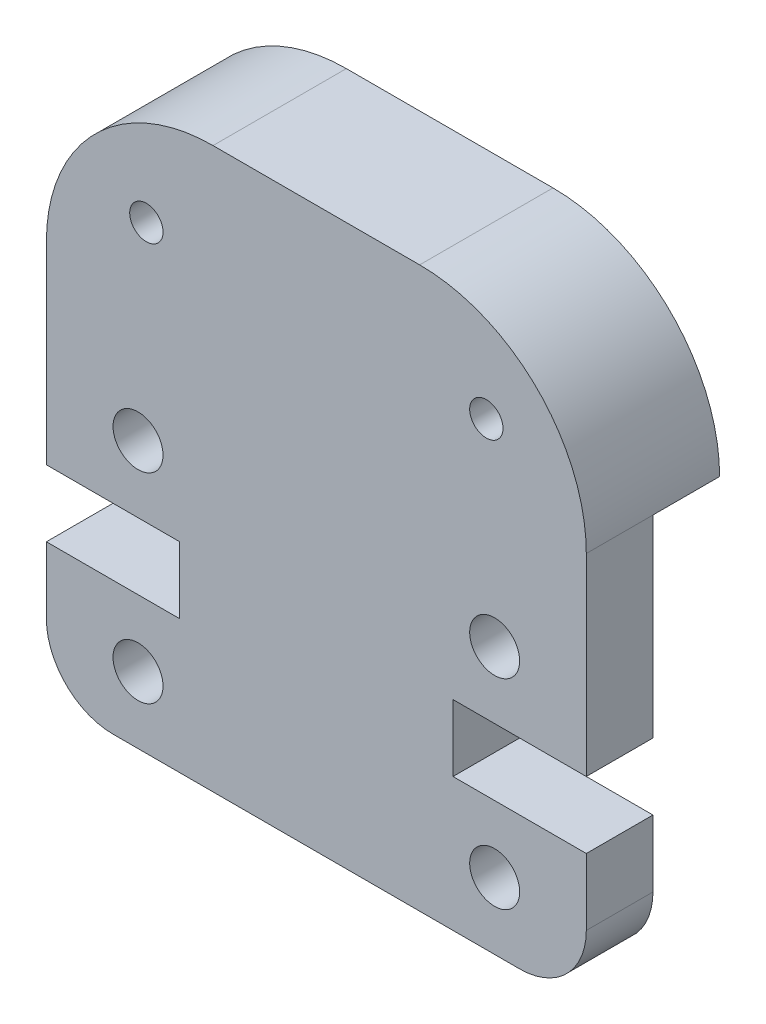
ISO-10303-21;
HEADER;
FILE_DESCRIPTION(('STEP AP214'),'2;1');
FILE_NAME('part.step','',(''),(''),'','','');
FILE_SCHEMA(('AUTOMOTIVE_DESIGN { 1 0 10303 214 1 1 1 1 }'));
ENDSEC;
DATA;
#1=APPLICATION_CONTEXT('core data for automotive mechanical design processes');
#2=APPLICATION_PROTOCOL_DEFINITION('international standard','automotive_design',2000,#1);
#3=PRODUCT_CONTEXT('',#1,'mechanical');
#4=PRODUCT('Part','Part','',(#3));
#5=PRODUCT_RELATED_PRODUCT_CATEGORY('part','',(#4));
#6=PRODUCT_DEFINITION_FORMATION('','',#4);
#7=PRODUCT_DEFINITION_CONTEXT('part definition',#1,'design');
#8=PRODUCT_DEFINITION('design','',#6,#7);
#9=PRODUCT_DEFINITION_SHAPE('','',#8);
#10=(LENGTH_UNIT() NAMED_UNIT(*) SI_UNIT(.MILLI.,.METRE.));
#11=(NAMED_UNIT(*) PLANE_ANGLE_UNIT() SI_UNIT($,.RADIAN.));
#12=(NAMED_UNIT(*) SI_UNIT($,.STERADIAN.) SOLID_ANGLE_UNIT());
#13=UNCERTAINTY_MEASURE_WITH_UNIT(LENGTH_MEASURE(1.E-05),#10,'distance_accuracy_value','');
#14=(GEOMETRIC_REPRESENTATION_CONTEXT(3) GLOBAL_UNCERTAINTY_ASSIGNED_CONTEXT((#13)) GLOBAL_UNIT_ASSIGNED_CONTEXT((#10,
#11,#12)) REPRESENTATION_CONTEXT('',''));
#15=CARTESIAN_POINT('',(0.,0.,0.));
#16=DIRECTION('',(0.,0.,1.));
#17=DIRECTION('',(1.,0.,0.));
#18=AXIS2_PLACEMENT_3D('',#15,#16,#17);
#19=CARTESIAN_POINT('',(5.,11.795,0.));
#20=DIRECTION('',(0.,0.,1.));
#21=DIRECTION('',(1.,0.,0.));
#22=AXIS2_PLACEMENT_3D('',#19,#20,#21);
#23=PLANE('',#22);
#24=CARTESIAN_POINT('',(13.1999999999957,13.7949999999999,0.));
#25=DIRECTION('',(0.,0.,1.));
#26=DIRECTION('',(-1.,0.,0.));
#27=AXIS2_PLACEMENT_3D('',#24,#25,#26);
#28=CIRCLE('',#27,0.499999999999945);
#29=CARTESIAN_POINT('',(12.6999999999957,13.7949999999999,0.));
#30=VERTEX_POINT('',#29);
#31=EDGE_CURVE('E263',#30,#30,#28,.T.);
#32=ORIENTED_EDGE('',*,*,#31,.T.);
#33=EDGE_LOOP('',(#32));
#34=FACE_BOUND('',#33,.T.);
#35=CARTESIAN_POINT('',(3.00000000000434,13.7949999999999,0.));
#36=DIRECTION('',(0.,0.,1.));
#37=DIRECTION('',(1.,0.,0.));
#38=AXIS2_PLACEMENT_3D('',#35,#36,#37);
#39=CIRCLE('',#38,0.499999999999945);
#40=CARTESIAN_POINT('',(3.50000000000429,13.7949999999999,0.));
#41=VERTEX_POINT('',#40);
#42=EDGE_CURVE('E267',#41,#41,#39,.T.);
#43=ORIENTED_EDGE('',*,*,#42,.T.);
#44=EDGE_LOOP('',(#43));
#45=FACE_BOUND('',#44,.T.);
#46=DIRECTION('',(-1.,0.,0.));
#47=VECTOR('',#46,1.);
#48=CARTESIAN_POINT('',(0.,11.795,0.));
#49=LINE('',#48,#47);
#50=CARTESIAN_POINT('',(16.2,11.795,0.));
#51=VERTEX_POINT('',#50);
#52=CARTESIAN_POINT('',(0.,11.795,0.));
#53=VERTEX_POINT('',#52);
#54=EDGE_CURVE('E221',#51,#53,#49,.T.);
#55=ORIENTED_EDGE('',*,*,#54,.T.);
#56=CARTESIAN_POINT('',(5.,11.795,0.));
#57=DIRECTION('',(0.,0.,1.));
#58=DIRECTION('',(1.,0.,0.));
#59=AXIS2_PLACEMENT_3D('',#56,#57,#58);
#60=CIRCLE('',#59,5.);
#61=CARTESIAN_POINT('',(5.,16.795,0.));
#62=VERTEX_POINT('',#61);
#63=EDGE_CURVE('E148',#62,#53,#60,.T.);
#64=ORIENTED_EDGE('',*,*,#63,.F.);
#65=DIRECTION('',(-1.,0.,0.));
#66=VECTOR('',#65,1.);
#67=CARTESIAN_POINT('',(5.,16.795,0.));
#68=LINE('',#67,#66);
#69=CARTESIAN_POINT('',(11.2,16.795,0.));
#70=VERTEX_POINT('',#69);
#71=EDGE_CURVE('E73',#70,#62,#68,.T.);
#72=ORIENTED_EDGE('',*,*,#71,.F.);
#73=CARTESIAN_POINT('',(11.2,11.795,0.));
#74=DIRECTION('',(0.,0.,1.));
#75=DIRECTION('',(-1.,0.,0.));
#76=AXIS2_PLACEMENT_3D('',#73,#74,#75);
#77=CIRCLE('',#76,5.);
#78=EDGE_CURVE('E67',#51,#70,#77,.T.);
#79=ORIENTED_EDGE('',*,*,#78,.F.);
#80=EDGE_LOOP('',(#55,#64,#72,#79));
#81=FACE_BOUND('',#80,.T.);
#82=ADVANCED_FACE('F34',(#34,#45,#81),#23,.F.);
#83=CARTESIAN_POINT('',(0.,6.00000000000001,4.));
#84=DIRECTION('',(1.,0.,0.));
#85=DIRECTION('',(0.,0.,-1.));
#86=AXIS2_PLACEMENT_3D('',#83,#84,#85);
#87=PLANE('',#86);
#88=DIRECTION('',(0.,-1.,0.));
#89=VECTOR('',#88,1.);
#90=CARTESIAN_POINT('',(0.,0.,2.));
#91=LINE('',#90,#89);
#92=CARTESIAN_POINT('',(0.,11.795,2.));
#93=VERTEX_POINT('',#92);
#94=CARTESIAN_POINT('',(0.,6.00000000000001,2.));
#95=VERTEX_POINT('',#94);
#96=EDGE_CURVE('E204',#93,#95,#91,.T.);
#97=ORIENTED_EDGE('',*,*,#96,.T.);
#98=DIRECTION('',(0.,0.,-1.));
#99=VECTOR('',#98,1.);
#100=CARTESIAN_POINT('',(0.,6.00000000000001,4.));
#101=LINE('',#100,#99);
#102=CARTESIAN_POINT('',(0.,6.00000000000001,4.));
#103=VERTEX_POINT('',#102);
#104=EDGE_CURVE('E44',#103,#95,#101,.T.);
#105=ORIENTED_EDGE('',*,*,#104,.F.);
#106=DIRECTION('',(0.,-1.,0.));
#107=VECTOR('',#106,1.);
#108=CARTESIAN_POINT('',(0.,6.00000000000001,4.));
#109=LINE('',#108,#107);
#110=CARTESIAN_POINT('',(0.,11.795,4.));
#111=VERTEX_POINT('',#110);
#112=EDGE_CURVE('E81',#111,#103,#109,.T.);
#113=ORIENTED_EDGE('',*,*,#112,.F.);
#114=DIRECTION('',(0.,0.,-1.));
#115=VECTOR('',#114,1.);
#116=CARTESIAN_POINT('',(0.,11.795,4.));
#117=LINE('',#116,#115);
#118=EDGE_CURVE('E11',#111,#93,#117,.T.);
#119=ORIENTED_EDGE('',*,*,#118,.T.);
#120=EDGE_LOOP('',(#97,#105,#113,#119));
#121=FACE_BOUND('',#120,.T.);
#122=ADVANCED_FACE('F202',(#121),#87,.F.);
#123=CARTESIAN_POINT('',(0.,6.00000000000001,4.));
#124=DIRECTION('',(0.,1.,0.));
#125=DIRECTION('',(0.,0.,1.));
#126=AXIS2_PLACEMENT_3D('',#123,#124,#125);
#127=PLANE('',#126);
#128=DIRECTION('',(-1.,0.,0.));
#129=VECTOR('',#128,1.);
#130=CARTESIAN_POINT('',(0.,6.00000000000001,2.));
#131=LINE('',#130,#129);
#132=CARTESIAN_POINT('',(4.,6.00000000000001,2.));
#133=VERTEX_POINT('',#132);
#134=EDGE_CURVE('E196',#133,#95,#131,.T.);
#135=ORIENTED_EDGE('',*,*,#134,.F.);
#136=DIRECTION('',(0.,0.,-1.));
#137=VECTOR('',#136,1.);
#138=CARTESIAN_POINT('',(4.,6.00000000000001,4.));
#139=LINE('',#138,#137);
#140=CARTESIAN_POINT('',(4.,6.00000000000001,4.));
#141=VERTEX_POINT('',#140);
#142=EDGE_CURVE('E185',#141,#133,#139,.T.);
#143=ORIENTED_EDGE('',*,*,#142,.F.);
#144=DIRECTION('',(1.,0.,0.));
#145=VECTOR('',#144,1.);
#146=CARTESIAN_POINT('',(0.,6.00000000000001,4.));
#147=LINE('',#146,#145);
#148=EDGE_CURVE('E197',#103,#141,#147,.T.);
#149=ORIENTED_EDGE('',*,*,#148,.F.);
#150=ORIENTED_EDGE('',*,*,#104,.T.);
#151=EDGE_LOOP('',(#135,#143,#149,#150));
#152=FACE_BOUND('',#151,.T.);
#153=ADVANCED_FACE('F193',(#152),#127,.F.);
#154=CARTESIAN_POINT('',(4.,6.00000000000001,4.));
#155=DIRECTION('',(1.,0.,0.));
#156=DIRECTION('',(0.,0.,-1.));
#157=AXIS2_PLACEMENT_3D('',#154,#155,#156);
#158=PLANE('',#157);
#159=DIRECTION('',(0.,1.,0.));
#160=VECTOR('',#159,1.);
#161=CARTESIAN_POINT('',(4.,6.00000000000001,2.));
#162=LINE('',#161,#160);
#163=CARTESIAN_POINT('',(4.,4.,2.));
#164=VERTEX_POINT('',#163);
#165=EDGE_CURVE('E253',#164,#133,#162,.T.);
#166=ORIENTED_EDGE('',*,*,#165,.F.);
#167=DIRECTION('',(0.,0.,-1.));
#168=VECTOR('',#167,1.);
#169=CARTESIAN_POINT('',(4.,4.,4.));
#170=LINE('',#169,#168);
#171=CARTESIAN_POINT('',(4.,4.,4.));
#172=VERTEX_POINT('',#171);
#173=EDGE_CURVE('E182',#172,#164,#170,.T.);
#174=ORIENTED_EDGE('',*,*,#173,.F.);
#175=DIRECTION('',(0.,-1.,0.));
#176=VECTOR('',#175,1.);
#177=CARTESIAN_POINT('',(4.,6.00000000000001,4.));
#178=LINE('',#177,#176);
#179=EDGE_CURVE('E283',#141,#172,#178,.T.);
#180=ORIENTED_EDGE('',*,*,#179,.F.);
#181=ORIENTED_EDGE('',*,*,#142,.T.);
#182=EDGE_LOOP('',(#166,#174,#180,#181));
#183=FACE_BOUND('',#182,.T.);
#184=ADVANCED_FACE('F329',(#183),#158,.F.);
#185=CARTESIAN_POINT('',(4.,4.,4.));
#186=DIRECTION('',(0.,-1.,0.));
#187=DIRECTION('',(0.,0.,-1.));
#188=AXIS2_PLACEMENT_3D('',#185,#186,#187);
#189=PLANE('',#188);
#190=DIRECTION('',(1.,0.,0.));
#191=VECTOR('',#190,1.);
#192=CARTESIAN_POINT('',(4.,4.,2.));
#193=LINE('',#192,#191);
#194=CARTESIAN_POINT('',(0.,4.,2.));
#195=VERTEX_POINT('',#194);
#196=EDGE_CURVE('E250',#195,#164,#193,.T.);
#197=ORIENTED_EDGE('',*,*,#196,.F.);
#198=DIRECTION('',(0.,0.,-1.));
#199=VECTOR('',#198,1.);
#200=CARTESIAN_POINT('',(0.,4.,4.));
#201=LINE('',#200,#199);
#202=CARTESIAN_POINT('',(0.,4.,4.));
#203=VERTEX_POINT('',#202);
#204=EDGE_CURVE('E179',#203,#195,#201,.T.);
#205=ORIENTED_EDGE('',*,*,#204,.F.);
#206=DIRECTION('',(-1.,0.,0.));
#207=VECTOR('',#206,1.);
#208=CARTESIAN_POINT('',(4.,4.,4.));
#209=LINE('',#208,#207);
#210=EDGE_CURVE('E285',#172,#203,#209,.T.);
#211=ORIENTED_EDGE('',*,*,#210,.F.);
#212=ORIENTED_EDGE('',*,*,#173,.T.);
#213=EDGE_LOOP('',(#197,#205,#211,#212));
#214=FACE_BOUND('',#213,.T.);
#215=ADVANCED_FACE('F333',(#214),#189,.F.);
#216=CARTESIAN_POINT('',(0.,2.,4.));
#217=DIRECTION('',(1.,0.,0.));
#218=DIRECTION('',(0.,0.,-1.));
#219=AXIS2_PLACEMENT_3D('',#216,#217,#218);
#220=PLANE('',#219);
#221=CARTESIAN_POINT('',(0.,2.,2.));
#222=VERTEX_POINT('',#221);
#223=EDGE_CURVE('E211',#195,#222,#91,.T.);
#224=ORIENTED_EDGE('',*,*,#223,.T.);
#225=DIRECTION('',(0.,0.,-1.));
#226=VECTOR('',#225,1.);
#227=CARTESIAN_POINT('',(0.,2.,4.));
#228=LINE('',#227,#226);
#229=CARTESIAN_POINT('',(0.,2.,4.));
#230=VERTEX_POINT('',#229);
#231=EDGE_CURVE('E176',#230,#222,#228,.T.);
#232=ORIENTED_EDGE('',*,*,#231,.F.);
#233=DIRECTION('',(0.,-1.,0.));
#234=VECTOR('',#233,1.);
#235=CARTESIAN_POINT('',(0.,2.,4.));
#236=LINE('',#235,#234);
#237=EDGE_CURVE('E287',#203,#230,#236,.T.);
#238=ORIENTED_EDGE('',*,*,#237,.F.);
#239=ORIENTED_EDGE('',*,*,#204,.T.);
#240=EDGE_LOOP('',(#224,#232,#238,#239));
#241=FACE_BOUND('',#240,.T.);
#242=ADVANCED_FACE('F391',(#241),#220,.F.);
#243=CARTESIAN_POINT('',(2.,2.,4.));
#244=DIRECTION('',(0.,0.,-1.));
#245=DIRECTION('',(-1.,0.,0.));
#246=AXIS2_PLACEMENT_3D('',#243,#244,#245);
#247=CYLINDRICAL_SURFACE('',#246,2.);
#248=CARTESIAN_POINT('',(2.,2.,2.));
#249=DIRECTION('',(0.,0.,-1.));
#250=DIRECTION('',(-1.,0.,0.));
#251=AXIS2_PLACEMENT_3D('',#248,#249,#250);
#252=CIRCLE('',#251,2.);
#253=CARTESIAN_POINT('',(2.,0.,2.));
#254=VERTEX_POINT('',#253);
#255=EDGE_CURVE('E247',#254,#222,#252,.T.);
#256=ORIENTED_EDGE('',*,*,#255,.F.);
#257=DIRECTION('',(0.,0.,-1.));
#258=VECTOR('',#257,1.);
#259=CARTESIAN_POINT('',(2.,0.,4.));
#260=LINE('',#259,#258);
#261=CARTESIAN_POINT('',(2.,0.,4.));
#262=VERTEX_POINT('',#261);
#263=EDGE_CURVE('E173',#262,#254,#260,.T.);
#264=ORIENTED_EDGE('',*,*,#263,.F.);
#265=CARTESIAN_POINT('',(2.,2.,4.));
#266=DIRECTION('',(0.,0.,1.));
#267=DIRECTION('',(1.,0.,0.));
#268=AXIS2_PLACEMENT_3D('',#265,#266,#267);
#269=CIRCLE('',#268,2.);
#270=EDGE_CURVE('E289',#230,#262,#269,.T.);
#271=ORIENTED_EDGE('',*,*,#270,.F.);
#272=ORIENTED_EDGE('',*,*,#231,.T.);
#273=EDGE_LOOP('',(#256,#264,#271,#272));
#274=FACE_BOUND('',#273,.T.);
#275=ADVANCED_FACE('F387',(#274),#247,.T.);
#276=CARTESIAN_POINT('',(2.,0.,4.));
#277=DIRECTION('',(0.,1.,0.));
#278=DIRECTION('',(-1.,0.,0.));
#279=AXIS2_PLACEMENT_3D('',#276,#277,#278);
#280=PLANE('',#279);
#281=DIRECTION('',(1.,0.,0.));
#282=VECTOR('',#281,1.);
#283=CARTESIAN_POINT('',(16.2,0.,2.));
#284=LINE('',#283,#282);
#285=CARTESIAN_POINT('',(14.2,0.,2.));
#286=VERTEX_POINT('',#285);
#287=EDGE_CURVE('E223',#254,#286,#284,.T.);
#288=ORIENTED_EDGE('',*,*,#287,.T.);
#289=DIRECTION('',(0.,0.,-1.));
#290=VECTOR('',#289,1.);
#291=CARTESIAN_POINT('',(14.2,0.,4.));
#292=LINE('',#291,#290);
#293=CARTESIAN_POINT('',(14.2,0.,4.));
#294=VERTEX_POINT('',#293);
#295=EDGE_CURVE('E170',#294,#286,#292,.T.);
#296=ORIENTED_EDGE('',*,*,#295,.F.);
#297=DIRECTION('',(1.,0.,0.));
#298=VECTOR('',#297,1.);
#299=CARTESIAN_POINT('',(2.,0.,4.));
#300=LINE('',#299,#298);
#301=EDGE_CURVE('E291',#262,#294,#300,.T.);
#302=ORIENTED_EDGE('',*,*,#301,.F.);
#303=ORIENTED_EDGE('',*,*,#263,.T.);
#304=EDGE_LOOP('',(#288,#296,#302,#303));
#305=FACE_BOUND('',#304,.T.);
#306=ADVANCED_FACE('F383',(#305),#280,.F.);
#307=CARTESIAN_POINT('',(14.2,2.,4.));
#308=DIRECTION('',(0.,0.,-1.));
#309=DIRECTION('',(-1.,0.,0.));
#310=AXIS2_PLACEMENT_3D('',#307,#308,#309);
#311=CYLINDRICAL_SURFACE('',#310,2.);
#312=CARTESIAN_POINT('',(14.2,2.,2.));
#313=DIRECTION('',(0.,0.,-1.));
#314=DIRECTION('',(-1.,0.,0.));
#315=AXIS2_PLACEMENT_3D('',#312,#313,#314);
#316=CIRCLE('',#315,2.);
#317=CARTESIAN_POINT('',(16.2,2.,2.));
#318=VERTEX_POINT('',#317);
#319=EDGE_CURVE('E244',#318,#286,#316,.T.);
#320=ORIENTED_EDGE('',*,*,#319,.F.);
#321=DIRECTION('',(0.,0.,-1.));
#322=VECTOR('',#321,1.);
#323=CARTESIAN_POINT('',(16.2,2.,4.));
#324=LINE('',#323,#322);
#325=CARTESIAN_POINT('',(16.2,2.,4.));
#326=VERTEX_POINT('',#325);
#327=EDGE_CURVE('E167',#326,#318,#324,.T.);
#328=ORIENTED_EDGE('',*,*,#327,.F.);
#329=CARTESIAN_POINT('',(14.2,2.,4.));
#330=DIRECTION('',(0.,0.,1.));
#331=DIRECTION('',(-1.,0.,0.));
#332=AXIS2_PLACEMENT_3D('',#329,#330,#331);
#333=CIRCLE('',#332,2.);
#334=EDGE_CURVE('E293',#294,#326,#333,.T.);
#335=ORIENTED_EDGE('',*,*,#334,.F.);
#336=ORIENTED_EDGE('',*,*,#295,.T.);
#337=EDGE_LOOP('',(#320,#328,#335,#336));
#338=FACE_BOUND('',#337,.T.);
#339=ADVANCED_FACE('F379',(#338),#311,.T.);
#340=CARTESIAN_POINT('',(16.2,2.,4.));
#341=DIRECTION('',(-1.,0.,0.));
#342=DIRECTION('',(0.,0.,1.));
#343=AXIS2_PLACEMENT_3D('',#340,#341,#342);
#344=PLANE('',#343);
#345=DIRECTION('',(0.,1.,0.));
#346=VECTOR('',#345,1.);
#347=CARTESIAN_POINT('',(16.2,11.795,2.));
#348=LINE('',#347,#346);
#349=CARTESIAN_POINT('',(16.2,4.,2.));
#350=VERTEX_POINT('',#349);
#351=EDGE_CURVE('E625',#318,#350,#348,.T.);
#352=ORIENTED_EDGE('',*,*,#351,.T.);
#353=DIRECTION('',(0.,0.,-1.));
#354=VECTOR('',#353,1.);
#355=CARTESIAN_POINT('',(16.2,4.,4.));
#356=LINE('',#355,#354);
#357=CARTESIAN_POINT('',(16.2,4.,4.));
#358=VERTEX_POINT('',#357);
#359=EDGE_CURVE('E164',#358,#350,#356,.T.);
#360=ORIENTED_EDGE('',*,*,#359,.F.);
#361=DIRECTION('',(0.,1.,0.));
#362=VECTOR('',#361,1.);
#363=CARTESIAN_POINT('',(16.2,2.,4.));
#364=LINE('',#363,#362);
#365=EDGE_CURVE('E295',#326,#358,#364,.T.);
#366=ORIENTED_EDGE('',*,*,#365,.F.);
#367=ORIENTED_EDGE('',*,*,#327,.T.);
#368=EDGE_LOOP('',(#352,#360,#366,#367));
#369=FACE_BOUND('',#368,.T.);
#370=ADVANCED_FACE('F375',(#369),#344,.F.);
#371=CARTESIAN_POINT('',(12.2,4.,4.));
#372=DIRECTION('',(0.,-1.,0.));
#373=DIRECTION('',(1.,0.,0.));
#374=AXIS2_PLACEMENT_3D('',#371,#372,#373);
#375=PLANE('',#374);
#376=DIRECTION('',(1.,0.,0.));
#377=VECTOR('',#376,1.);
#378=CARTESIAN_POINT('',(12.2,4.,2.));
#379=LINE('',#378,#377);
#380=CARTESIAN_POINT('',(12.2,4.,2.));
#381=VERTEX_POINT('',#380);
#382=EDGE_CURVE('E241',#381,#350,#379,.T.);
#383=ORIENTED_EDGE('',*,*,#382,.F.);
#384=DIRECTION('',(0.,0.,-1.));
#385=VECTOR('',#384,1.);
#386=CARTESIAN_POINT('',(12.2,4.,4.));
#387=LINE('',#386,#385);
#388=CARTESIAN_POINT('',(12.2,4.,4.));
#389=VERTEX_POINT('',#388);
#390=EDGE_CURVE('E161',#389,#381,#387,.T.);
#391=ORIENTED_EDGE('',*,*,#390,.F.);
#392=DIRECTION('',(-1.,0.,0.));
#393=VECTOR('',#392,1.);
#394=CARTESIAN_POINT('',(12.2,4.,4.));
#395=LINE('',#394,#393);
#396=EDGE_CURVE('E297',#358,#389,#395,.T.);
#397=ORIENTED_EDGE('',*,*,#396,.F.);
#398=ORIENTED_EDGE('',*,*,#359,.T.);
#399=EDGE_LOOP('',(#383,#391,#397,#398));
#400=FACE_BOUND('',#399,.T.);
#401=ADVANCED_FACE('F372',(#400),#375,.F.);
#402=CARTESIAN_POINT('',(12.2,6.,4.));
#403=DIRECTION('',(-1.,0.,0.));
#404=DIRECTION('',(0.,0.,1.));
#405=AXIS2_PLACEMENT_3D('',#402,#403,#404);
#406=PLANE('',#405);
#407=DIRECTION('',(0.,-1.,0.));
#408=VECTOR('',#407,1.);
#409=CARTESIAN_POINT('',(12.2,6.,2.));
#410=LINE('',#409,#408);
#411=CARTESIAN_POINT('',(12.2,6.,2.));
#412=VERTEX_POINT('',#411);
#413=EDGE_CURVE('E238',#412,#381,#410,.T.);
#414=ORIENTED_EDGE('',*,*,#413,.F.);
#415=DIRECTION('',(0.,0.,-1.));
#416=VECTOR('',#415,1.);
#417=CARTESIAN_POINT('',(12.2,6.,4.));
#418=LINE('',#417,#416);
#419=CARTESIAN_POINT('',(12.2,6.,4.));
#420=VERTEX_POINT('',#419);
#421=EDGE_CURVE('E158',#420,#412,#418,.T.);
#422=ORIENTED_EDGE('',*,*,#421,.F.);
#423=DIRECTION('',(0.,1.,0.));
#424=VECTOR('',#423,1.);
#425=CARTESIAN_POINT('',(12.2,6.,4.));
#426=LINE('',#425,#424);
#427=EDGE_CURVE('E299',#389,#420,#426,.T.);
#428=ORIENTED_EDGE('',*,*,#427,.F.);
#429=ORIENTED_EDGE('',*,*,#390,.T.);
#430=EDGE_LOOP('',(#414,#422,#428,#429));
#431=FACE_BOUND('',#430,.T.);
#432=ADVANCED_FACE('F306',(#431),#406,.F.);
#433=CARTESIAN_POINT('',(16.2,6.00000000000001,4.));
#434=DIRECTION('',(0.,1.,0.));
#435=DIRECTION('',(-1.,0.,0.));
#436=AXIS2_PLACEMENT_3D('',#433,#434,#435);
#437=PLANE('',#436);
#438=DIRECTION('',(-1.,0.,0.));
#439=VECTOR('',#438,1.);
#440=CARTESIAN_POINT('',(16.2,6.00000000000001,2.));
#441=LINE('',#440,#439);
#442=CARTESIAN_POINT('',(16.2,6.00000000000001,2.));
#443=VERTEX_POINT('',#442);
#444=EDGE_CURVE('E235',#443,#412,#441,.T.);
#445=ORIENTED_EDGE('',*,*,#444,.F.);
#446=DIRECTION('',(0.,0.,-1.));
#447=VECTOR('',#446,1.);
#448=CARTESIAN_POINT('',(16.2,6.00000000000001,4.));
#449=LINE('',#448,#447);
#450=CARTESIAN_POINT('',(16.2,6.00000000000001,4.));
#451=VERTEX_POINT('',#450);
#452=EDGE_CURVE('E139',#451,#443,#449,.T.);
#453=ORIENTED_EDGE('',*,*,#452,.F.);
#454=DIRECTION('',(1.,0.,0.));
#455=VECTOR('',#454,1.);
#456=CARTESIAN_POINT('',(16.2,6.00000000000001,4.));
#457=LINE('',#456,#455);
#458=EDGE_CURVE('E127',#420,#451,#457,.T.);
#459=ORIENTED_EDGE('',*,*,#458,.F.);
#460=ORIENTED_EDGE('',*,*,#421,.T.);
#461=EDGE_LOOP('',(#445,#453,#459,#460));
#462=FACE_BOUND('',#461,.T.);
#463=ADVANCED_FACE('F310',(#462),#437,.F.);
#464=CARTESIAN_POINT('',(16.2,6.00000000000001,4.));
#465=DIRECTION('',(-1.,0.,0.));
#466=DIRECTION('',(0.,-1.,0.));
#467=AXIS2_PLACEMENT_3D('',#464,#465,#466);
#468=PLANE('',#467);
#469=CARTESIAN_POINT('',(16.2,11.795,2.));
#470=VERTEX_POINT('',#469);
#471=EDGE_CURVE('E138',#443,#470,#348,.T.);
#472=ORIENTED_EDGE('',*,*,#471,.T.);
#473=DIRECTION('',(0.,0.,-1.));
#474=VECTOR('',#473,1.);
#475=CARTESIAN_POINT('',(16.2,11.795,4.));
#476=LINE('',#475,#474);
#477=CARTESIAN_POINT('',(16.2,11.795,4.));
#478=VERTEX_POINT('',#477);
#479=EDGE_CURVE('E134',#478,#470,#476,.T.);
#480=ORIENTED_EDGE('',*,*,#479,.F.);
#481=DIRECTION('',(0.,1.,0.));
#482=VECTOR('',#481,1.);
#483=CARTESIAN_POINT('',(16.2,6.00000000000001,4.));
#484=LINE('',#483,#482);
#485=EDGE_CURVE('E120',#451,#478,#484,.T.);
#486=ORIENTED_EDGE('',*,*,#485,.F.);
#487=ORIENTED_EDGE('',*,*,#452,.T.);
#488=EDGE_LOOP('',(#472,#480,#486,#487));
#489=FACE_BOUND('',#488,.T.);
#490=ADVANCED_FACE('F135',(#489),#468,.F.);
#491=CARTESIAN_POINT('',(13.4499999999991,2.,4.));
#492=DIRECTION('',(0.,0.,-1.));
#493=DIRECTION('',(-1.,0.,0.));
#494=AXIS2_PLACEMENT_3D('',#491,#492,#493);
#495=CYLINDRICAL_SURFACE('',#494,0.750000000000882);
#496=CARTESIAN_POINT('',(13.4499999999991,2.,4.));
#497=DIRECTION('',(0.,0.,1.));
#498=DIRECTION('',(-1.,0.,0.));
#499=AXIS2_PLACEMENT_3D('',#496,#497,#498);
#500=CIRCLE('',#499,0.750000000000882);
#501=CARTESIAN_POINT('',(12.6999999999982,2.,4.));
#502=VERTEX_POINT('',#501);
#503=EDGE_CURVE('E151',#502,#502,#500,.T.);
#504=ORIENTED_EDGE('',*,*,#503,.T.);
#505=EDGE_LOOP('',(#504));
#506=FACE_BOUND('',#505,.T.);
#507=CARTESIAN_POINT('',(13.4499999999991,2.,2.));
#508=DIRECTION('',(0.,0.,-1.));
#509=DIRECTION('',(-1.,0.,0.));
#510=AXIS2_PLACEMENT_3D('',#507,#508,#509);
#511=CIRCLE('',#510,0.750000000000882);
#512=CARTESIAN_POINT('',(12.6999999999982,2.,2.));
#513=VERTEX_POINT('',#512);
#514=EDGE_CURVE('E232',#513,#513,#511,.T.);
#515=ORIENTED_EDGE('',*,*,#514,.T.);
#516=EDGE_LOOP('',(#515));
#517=FACE_BOUND('',#516,.T.);
#518=ADVANCED_FACE('F367',(#506,#517),#495,.F.);
#519=CARTESIAN_POINT('',(13.4499999999991,7.99999999999954,4.));
#520=DIRECTION('',(0.,0.,-1.));
#521=DIRECTION('',(-1.,0.,0.));
#522=AXIS2_PLACEMENT_3D('',#519,#520,#521);
#523=CYLINDRICAL_SURFACE('',#522,0.750000000000887);
#524=CARTESIAN_POINT('',(13.4499999999991,7.99999999999954,4.));
#525=DIRECTION('',(0.,0.,1.));
#526=DIRECTION('',(1.,0.,0.));
#527=AXIS2_PLACEMENT_3D('',#524,#525,#526);
#528=CIRCLE('',#527,0.750000000000887);
#529=CARTESIAN_POINT('',(14.2,7.99999999999954,4.));
#530=VERTEX_POINT('',#529);
#531=EDGE_CURVE('E273',#530,#530,#528,.T.);
#532=ORIENTED_EDGE('',*,*,#531,.T.);
#533=EDGE_LOOP('',(#532));
#534=FACE_BOUND('',#533,.T.);
#535=CARTESIAN_POINT('',(13.4499999999991,7.99999999999954,2.));
#536=DIRECTION('',(0.,0.,-1.));
#537=DIRECTION('',(-1.,0.,0.));
#538=AXIS2_PLACEMENT_3D('',#535,#536,#537);
#539=CIRCLE('',#538,0.750000000000887);
#540=CARTESIAN_POINT('',(12.6999999999982,7.99999999999954,2.));
#541=VERTEX_POINT('',#540);
#542=EDGE_CURVE('E229',#541,#541,#539,.T.);
#543=ORIENTED_EDGE('',*,*,#542,.T.);
#544=EDGE_LOOP('',(#543));
#545=FACE_BOUND('',#544,.T.);
#546=ADVANCED_FACE('F455',(#534,#545),#523,.F.);
#547=CARTESIAN_POINT('',(2.75000000000089,2.,4.));
#548=DIRECTION('',(0.,0.,-1.));
#549=DIRECTION('',(-1.,0.,0.));
#550=AXIS2_PLACEMENT_3D('',#547,#548,#549);
#551=CYLINDRICAL_SURFACE('',#550,0.750000000000087);
#552=CARTESIAN_POINT('',(2.75000000000089,2.,4.));
#553=DIRECTION('',(0.,0.,1.));
#554=DIRECTION('',(1.,0.,0.));
#555=AXIS2_PLACEMENT_3D('',#552,#553,#554);
#556=CIRCLE('',#555,0.750000000000087);
#557=CARTESIAN_POINT('',(3.50000000000098,2.,4.));
#558=VERTEX_POINT('',#557);
#559=EDGE_CURVE('E260',#558,#558,#556,.T.);
#560=ORIENTED_EDGE('',*,*,#559,.T.);
#561=EDGE_LOOP('',(#560));
#562=FACE_BOUND('',#561,.T.);
#563=CARTESIAN_POINT('',(2.75000000000089,2.,2.));
#564=DIRECTION('',(0.,0.,-1.));
#565=DIRECTION('',(-1.,0.,0.));
#566=AXIS2_PLACEMENT_3D('',#563,#564,#565);
#567=CIRCLE('',#566,0.750000000000087);
#568=CARTESIAN_POINT('',(2.00000000000081,2.,2.));
#569=VERTEX_POINT('',#568);
#570=EDGE_CURVE('E226',#569,#569,#567,.T.);
#571=ORIENTED_EDGE('',*,*,#570,.T.);
#572=EDGE_LOOP('',(#571));
#573=FACE_BOUND('',#572,.T.);
#574=ADVANCED_FACE('F462',(#562,#573),#551,.F.);
#575=CARTESIAN_POINT('',(2.75000000000089,7.99999999999954,4.));
#576=DIRECTION('',(0.,0.,-1.));
#577=DIRECTION('',(-1.,0.,0.));
#578=AXIS2_PLACEMENT_3D('',#575,#576,#577);
#579=CYLINDRICAL_SURFACE('',#578,0.750000000000087);
#580=CARTESIAN_POINT('',(2.75000000000089,7.99999999999954,4.));
#581=DIRECTION('',(0.,0.,1.));
#582=DIRECTION('',(-1.,0.,0.));
#583=AXIS2_PLACEMENT_3D('',#580,#581,#582);
#584=CIRCLE('',#583,0.750000000000087);
#585=CARTESIAN_POINT('',(2.0000000000008,7.99999999999954,4.));
#586=VERTEX_POINT('',#585);
#587=EDGE_CURVE('E257',#586,#586,#584,.T.);
#588=ORIENTED_EDGE('',*,*,#587,.T.);
#589=EDGE_LOOP('',(#588));
#590=FACE_BOUND('',#589,.T.);
#591=CARTESIAN_POINT('',(2.75000000000089,7.99999999999954,2.));
#592=DIRECTION('',(0.,0.,-1.));
#593=DIRECTION('',(-1.,0.,0.));
#594=AXIS2_PLACEMENT_3D('',#591,#592,#593);
#595=CIRCLE('',#594,0.750000000000087);
#596=CARTESIAN_POINT('',(2.0000000000008,7.99999999999954,2.));
#597=VERTEX_POINT('',#596);
#598=EDGE_CURVE('E38',#597,#597,#595,.T.);
#599=ORIENTED_EDGE('',*,*,#598,.T.);
#600=EDGE_LOOP('',(#599));
#601=FACE_BOUND('',#600,.T.);
#602=ADVANCED_FACE('F470',(#590,#601),#579,.F.);
#603=CARTESIAN_POINT('',(5.,11.795,4.));
#604=DIRECTION('',(0.,0.,1.));
#605=DIRECTION('',(1.,0.,0.));
#606=AXIS2_PLACEMENT_3D('',#603,#604,#605);
#607=PLANE('',#606);
#608=ORIENTED_EDGE('',*,*,#559,.F.);
#609=EDGE_LOOP('',(#608));
#610=FACE_BOUND('',#609,.T.);
#611=CARTESIAN_POINT('',(3.00000000000434,13.7949999999999,4.));
#612=DIRECTION('',(0.,0.,1.));
#613=DIRECTION('',(1.,0.,0.));
#614=AXIS2_PLACEMENT_3D('',#611,#612,#613);
#615=CIRCLE('',#614,0.499999999999945);
#616=CARTESIAN_POINT('',(3.50000000000429,13.7949999999999,4.));
#617=VERTEX_POINT('',#616);
#618=EDGE_CURVE('E270',#617,#617,#615,.T.);
#619=ORIENTED_EDGE('',*,*,#618,.F.);
#620=EDGE_LOOP('',(#619));
#621=FACE_BOUND('',#620,.T.);
#622=ORIENTED_EDGE('',*,*,#503,.F.);
#623=EDGE_LOOP('',(#622));
#624=FACE_BOUND('',#623,.T.);
#625=CARTESIAN_POINT('',(5.,11.795,4.));
#626=DIRECTION('',(0.,0.,1.));
#627=DIRECTION('',(1.,0.,0.));
#628=AXIS2_PLACEMENT_3D('',#625,#626,#627);
#629=CIRCLE('',#628,5.);
#630=CARTESIAN_POINT('',(5.,16.795,4.));
#631=VERTEX_POINT('',#630);
#632=EDGE_CURVE('E154',#631,#111,#629,.T.);
#633=ORIENTED_EDGE('',*,*,#632,.T.);
#634=ORIENTED_EDGE('',*,*,#112,.T.);
#635=ORIENTED_EDGE('',*,*,#148,.T.);
#636=ORIENTED_EDGE('',*,*,#179,.T.);
#637=ORIENTED_EDGE('',*,*,#210,.T.);
#638=ORIENTED_EDGE('',*,*,#237,.T.);
#639=ORIENTED_EDGE('',*,*,#270,.T.);
#640=ORIENTED_EDGE('',*,*,#301,.T.);
#641=ORIENTED_EDGE('',*,*,#334,.T.);
#642=ORIENTED_EDGE('',*,*,#365,.T.);
#643=ORIENTED_EDGE('',*,*,#396,.T.);
#644=ORIENTED_EDGE('',*,*,#427,.T.);
#645=ORIENTED_EDGE('',*,*,#458,.T.);
#646=ORIENTED_EDGE('',*,*,#485,.T.);
#647=CARTESIAN_POINT('',(11.2,11.795,4.));
#648=DIRECTION('',(0.,0.,1.));
#649=DIRECTION('',(-1.,0.,0.));
#650=AXIS2_PLACEMENT_3D('',#647,#648,#649);
#651=CIRCLE('',#650,5.);
#652=CARTESIAN_POINT('',(11.2,16.795,4.));
#653=VERTEX_POINT('',#652);
#654=EDGE_CURVE('E125',#478,#653,#651,.T.);
#655=ORIENTED_EDGE('',*,*,#654,.T.);
#656=DIRECTION('',(-1.,0.,0.));
#657=VECTOR('',#656,1.);
#658=CARTESIAN_POINT('',(5.,16.795,4.));
#659=LINE('',#658,#657);
#660=EDGE_CURVE('E52',#653,#631,#659,.T.);
#661=ORIENTED_EDGE('',*,*,#660,.T.);
#662=EDGE_LOOP('',(#633,#634,#635,#636,#637,#638,#639,#640,#641,#642,#643,#644,#645,#646,#655,#661));
#663=FACE_BOUND('',#662,.T.);
#664=ORIENTED_EDGE('',*,*,#531,.F.);
#665=EDGE_LOOP('',(#664));
#666=FACE_BOUND('',#665,.T.);
#667=CARTESIAN_POINT('',(13.1999999999957,13.7949999999999,4.));
#668=DIRECTION('',(0.,0.,1.));
#669=DIRECTION('',(-1.,0.,0.));
#670=AXIS2_PLACEMENT_3D('',#667,#668,#669);
#671=CIRCLE('',#670,0.499999999999945);
#672=CARTESIAN_POINT('',(12.6999999999957,13.7949999999999,4.));
#673=VERTEX_POINT('',#672);
#674=EDGE_CURVE('E264',#673,#673,#671,.T.);
#675=ORIENTED_EDGE('',*,*,#674,.F.);
#676=EDGE_LOOP('',(#675));
#677=FACE_BOUND('',#676,.T.);
#678=ORIENTED_EDGE('',*,*,#587,.F.);
#679=EDGE_LOOP('',(#678));
#680=FACE_BOUND('',#679,.T.);
#681=ADVANCED_FACE('F122',(#610,#621,#624,#663,#666,#677,#680),#607,.T.);
#682=CARTESIAN_POINT('',(5.,11.795,4.));
#683=DIRECTION('',(0.,0.,-1.));
#684=DIRECTION('',(-1.,0.,0.));
#685=AXIS2_PLACEMENT_3D('',#682,#683,#684);
#686=CYLINDRICAL_SURFACE('',#685,5.);
#687=ORIENTED_EDGE('',*,*,#63,.T.);
#688=DIRECTION('',(0.,0.,-1.));
#689=VECTOR('',#688,1.);
#690=CARTESIAN_POINT('',(0.,11.795,2.));
#691=LINE('',#690,#689);
#692=EDGE_CURVE('E210',#93,#53,#691,.T.);
#693=ORIENTED_EDGE('',*,*,#692,.F.);
#694=ORIENTED_EDGE('',*,*,#118,.F.);
#695=ORIENTED_EDGE('',*,*,#632,.F.);
#696=DIRECTION('',(0.,0.,-1.));
#697=VECTOR('',#696,1.);
#698=CARTESIAN_POINT('',(5.,16.795,4.));
#699=LINE('',#698,#697);
#700=EDGE_CURVE('E144',#631,#62,#699,.T.);
#701=ORIENTED_EDGE('',*,*,#700,.T.);
#702=EDGE_LOOP('',(#687,#693,#694,#695,#701));
#703=FACE_BOUND('',#702,.T.);
#704=ADVANCED_FACE('F36',(#703),#686,.T.);
#705=CARTESIAN_POINT('',(11.2,11.795,4.));
#706=DIRECTION('',(0.,0.,-1.));
#707=DIRECTION('',(-1.,0.,0.));
#708=AXIS2_PLACEMENT_3D('',#705,#706,#707);
#709=CYLINDRICAL_SURFACE('',#708,5.);
#710=ORIENTED_EDGE('',*,*,#78,.T.);
#711=DIRECTION('',(0.,0.,-1.));
#712=VECTOR('',#711,1.);
#713=CARTESIAN_POINT('',(11.2,16.795,4.));
#714=LINE('',#713,#712);
#715=EDGE_CURVE('E140',#653,#70,#714,.T.);
#716=ORIENTED_EDGE('',*,*,#715,.F.);
#717=ORIENTED_EDGE('',*,*,#654,.F.);
#718=ORIENTED_EDGE('',*,*,#479,.T.);
#719=DIRECTION('',(0.,0.,-1.));
#720=VECTOR('',#719,1.);
#721=CARTESIAN_POINT('',(16.2,11.795,2.));
#722=LINE('',#721,#720);
#723=EDGE_CURVE('E214',#470,#51,#722,.T.);
#724=ORIENTED_EDGE('',*,*,#723,.T.);
#725=EDGE_LOOP('',(#710,#716,#717,#718,#724));
#726=FACE_BOUND('',#725,.T.);
#727=ADVANCED_FACE('F142',(#726),#709,.T.);
#728=CARTESIAN_POINT('',(5.,16.795,4.));
#729=DIRECTION('',(0.,-1.,0.));
#730=DIRECTION('',(0.,0.,-1.));
#731=AXIS2_PLACEMENT_3D('',#728,#729,#730);
#732=PLANE('',#731);
#733=ORIENTED_EDGE('',*,*,#71,.T.);
#734=ORIENTED_EDGE('',*,*,#700,.F.);
#735=ORIENTED_EDGE('',*,*,#660,.F.);
#736=ORIENTED_EDGE('',*,*,#715,.T.);
#737=EDGE_LOOP('',(#733,#734,#735,#736));
#738=FACE_BOUND('',#737,.T.);
#739=ADVANCED_FACE('F359',(#738),#732,.F.);
#740=CARTESIAN_POINT('',(3.00000000000434,13.7949999999999,4.));
#741=DIRECTION('',(0.,0.,-1.));
#742=DIRECTION('',(-1.,0.,0.));
#743=AXIS2_PLACEMENT_3D('',#740,#741,#742);
#744=CYLINDRICAL_SURFACE('',#743,0.499999999999945);
#745=ORIENTED_EDGE('',*,*,#618,.T.);
#746=EDGE_LOOP('',(#745));
#747=FACE_BOUND('',#746,.T.);
#748=ORIENTED_EDGE('',*,*,#42,.F.);
#749=EDGE_LOOP('',(#748));
#750=FACE_BOUND('',#749,.T.);
#751=ADVANCED_FACE('F362',(#747,#750),#744,.F.);
#752=CARTESIAN_POINT('',(13.1999999999957,13.7949999999999,4.));
#753=DIRECTION('',(0.,0.,-1.));
#754=DIRECTION('',(-1.,0.,0.));
#755=AXIS2_PLACEMENT_3D('',#752,#753,#754);
#756=CYLINDRICAL_SURFACE('',#755,0.499999999999945);
#757=ORIENTED_EDGE('',*,*,#674,.T.);
#758=EDGE_LOOP('',(#757));
#759=FACE_BOUND('',#758,.T.);
#760=ORIENTED_EDGE('',*,*,#31,.F.);
#761=EDGE_LOOP('',(#760));
#762=FACE_BOUND('',#761,.T.);
#763=ADVANCED_FACE('F505',(#759,#762),#756,.F.);
#764=CARTESIAN_POINT('',(0.,0.,2.));
#765=DIRECTION('',(0.,0.,-1.));
#766=DIRECTION('',(-1.,0.,0.));
#767=AXIS2_PLACEMENT_3D('',#764,#765,#766);
#768=PLANE('',#767);
#769=ORIENTED_EDGE('',*,*,#514,.F.);
#770=EDGE_LOOP('',(#769));
#771=FACE_BOUND('',#770,.T.);
#772=ORIENTED_EDGE('',*,*,#542,.F.);
#773=EDGE_LOOP('',(#772));
#774=FACE_BOUND('',#773,.T.);
#775=ORIENTED_EDGE('',*,*,#570,.F.);
#776=EDGE_LOOP('',(#775));
#777=FACE_BOUND('',#776,.T.);
#778=ORIENTED_EDGE('',*,*,#598,.F.);
#779=EDGE_LOOP('',(#778));
#780=FACE_BOUND('',#779,.T.);
#781=ORIENTED_EDGE('',*,*,#134,.T.);
#782=ORIENTED_EDGE('',*,*,#96,.F.);
#783=DIRECTION('',(-1.,0.,0.));
#784=VECTOR('',#783,1.);
#785=CARTESIAN_POINT('',(0.,11.795,2.));
#786=LINE('',#785,#784);
#787=EDGE_CURVE('E217',#470,#93,#786,.T.);
#788=ORIENTED_EDGE('',*,*,#787,.F.);
#789=ORIENTED_EDGE('',*,*,#471,.F.);
#790=ORIENTED_EDGE('',*,*,#444,.T.);
#791=ORIENTED_EDGE('',*,*,#413,.T.);
#792=ORIENTED_EDGE('',*,*,#382,.T.);
#793=ORIENTED_EDGE('',*,*,#351,.F.);
#794=ORIENTED_EDGE('',*,*,#319,.T.);
#795=ORIENTED_EDGE('',*,*,#287,.F.);
#796=ORIENTED_EDGE('',*,*,#255,.T.);
#797=ORIENTED_EDGE('',*,*,#223,.F.);
#798=ORIENTED_EDGE('',*,*,#196,.T.);
#799=ORIENTED_EDGE('',*,*,#165,.T.);
#800=EDGE_LOOP('',(#781,#782,#788,#789,#790,#791,#792,#793,#794,#795,#796,#797,#798,#799));
#801=FACE_BOUND('',#800,.T.);
#802=ADVANCED_FACE('F326',(#771,#774,#777,#780,#801),#768,.T.);
#803=CARTESIAN_POINT('',(0.,11.795,2.));
#804=DIRECTION('',(0.,-1.,0.));
#805=DIRECTION('',(1.,0.,0.));
#806=AXIS2_PLACEMENT_3D('',#803,#804,#805);
#807=PLANE('',#806);
#808=ORIENTED_EDGE('',*,*,#54,.F.);
#809=ORIENTED_EDGE('',*,*,#723,.F.);
#810=ORIENTED_EDGE('',*,*,#787,.T.);
#811=ORIENTED_EDGE('',*,*,#692,.T.);
#812=EDGE_LOOP('',(#808,#809,#810,#811));
#813=FACE_BOUND('',#812,.T.);
#814=ADVANCED_FACE('F345',(#813),#807,.T.);
#815=CLOSED_SHELL('',(#82,#122,#153,#184,#215,#242,#275,#306,#339,#370,#401,#432,#463,#490,#518,
#546,#574,#602,#681,#704,#727,#739,#751,#763,#802,#814));
#816=MANIFOLD_SOLID_BREP('B2',#815);
#817=ADVANCED_BREP_SHAPE_REPRESENTATION('',(#18,#816),#14);
#818=SHAPE_DEFINITION_REPRESENTATION(#9,#817);
ENDSEC;
END-ISO-10303-21;
